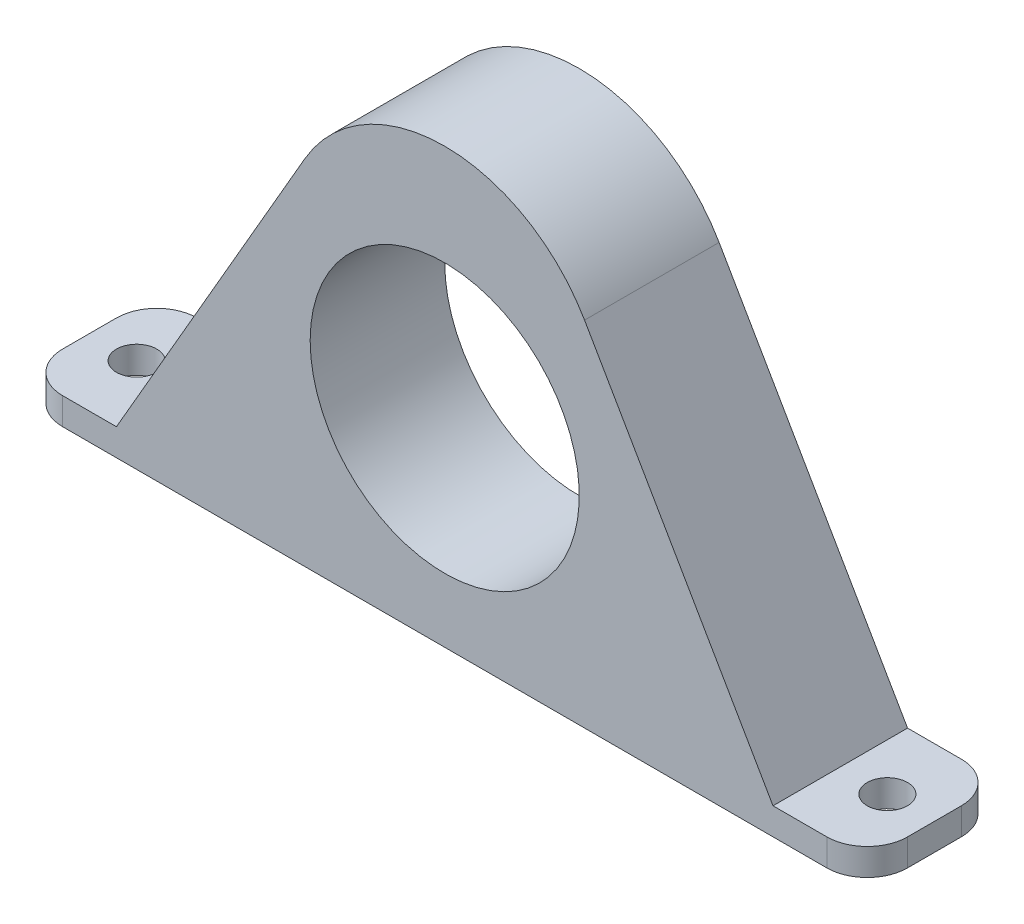
ISO-10303-21;
HEADER;
FILE_DESCRIPTION(('STEP AP214'),'2;1');
FILE_NAME('part.step','',(''),(''),'','','');
FILE_SCHEMA(('AUTOMOTIVE_DESIGN { 1 0 10303 214 1 1 1 1 }'));
ENDSEC;
DATA;
#1=APPLICATION_CONTEXT('core data for automotive mechanical design processes');
#2=APPLICATION_PROTOCOL_DEFINITION('international standard','automotive_design',2000,#1);
#3=PRODUCT_CONTEXT('',#1,'mechanical');
#4=PRODUCT('Part','Part','',(#3));
#5=PRODUCT_RELATED_PRODUCT_CATEGORY('part','',(#4));
#6=PRODUCT_DEFINITION_FORMATION('','',#4);
#7=PRODUCT_DEFINITION_CONTEXT('part definition',#1,'design');
#8=PRODUCT_DEFINITION('design','',#6,#7);
#9=PRODUCT_DEFINITION_SHAPE('','',#8);
#10=(LENGTH_UNIT() NAMED_UNIT(*) SI_UNIT(.MILLI.,.METRE.));
#11=(NAMED_UNIT(*) PLANE_ANGLE_UNIT() SI_UNIT($,.RADIAN.));
#12=(NAMED_UNIT(*) SI_UNIT($,.STERADIAN.) SOLID_ANGLE_UNIT());
#13=UNCERTAINTY_MEASURE_WITH_UNIT(LENGTH_MEASURE(1.E-05),#10,'distance_accuracy_value','');
#14=(GEOMETRIC_REPRESENTATION_CONTEXT(3) GLOBAL_UNCERTAINTY_ASSIGNED_CONTEXT((#13)) GLOBAL_UNIT_ASSIGNED_CONTEXT((#10,
#11,#12)) REPRESENTATION_CONTEXT('',''));
#15=CARTESIAN_POINT('',(0.,0.,0.));
#16=DIRECTION('',(0.,0.,1.));
#17=DIRECTION('',(1.,0.,0.));
#18=AXIS2_PLACEMENT_3D('',#15,#16,#17);
#19=CARTESIAN_POINT('',(0.,29.4999999999999,10.));
#20=DIRECTION('',(0.866025403784436,-0.500000000000004,0.));
#21=DIRECTION('',(0.500000000000004,0.866025403784436,0.));
#22=AXIS2_PLACEMENT_3D('',#19,#20,#21);
#23=PLANE('',#22);
#24=DIRECTION('',(-0.500000000000004,-0.866025403784436,0.));
#25=VECTOR('',#24,1.);
#26=CARTESIAN_POINT('',(0.,29.4999999999999,10.));
#27=LINE('',#26,#25);
#28=CARTESIAN_POINT('',(-10.3923048454133,11.5,10.));
#29=VERTEX_POINT('',#28);
#30=CARTESIAN_POINT('',(-24.3961061455568,-12.7552953509474,10.));
#31=VERTEX_POINT('',#30);
#32=EDGE_CURVE('E128',#29,#31,#27,.T.);
#33=ORIENTED_EDGE('',*,*,#32,.F.);
#34=DIRECTION('',(0.,0.,-1.));
#35=VECTOR('',#34,1.);
#36=CARTESIAN_POINT('',(-10.3923048454133,11.5,0.));
#37=LINE('',#36,#35);
#38=CARTESIAN_POINT('',(-10.3923048454133,11.5,0.));
#39=VERTEX_POINT('',#38);
#40=EDGE_CURVE('E144',#29,#39,#37,.T.);
#41=ORIENTED_EDGE('',*,*,#40,.T.);
#42=DIRECTION('',(-0.500000000000004,-0.866025403784436,0.));
#43=VECTOR('',#42,1.);
#44=CARTESIAN_POINT('',(0.,29.4999999999999,0.));
#45=LINE('',#44,#43);
#46=CARTESIAN_POINT('',(-24.3961061455568,-12.7552953509474,0.));
#47=VERTEX_POINT('',#46);
#48=EDGE_CURVE('E143',#39,#47,#45,.T.);
#49=ORIENTED_EDGE('',*,*,#48,.T.);
#50=DIRECTION('',(0.,0.,-1.));
#51=VECTOR('',#50,1.);
#52=CARTESIAN_POINT('',(-24.3961061455568,-12.7552953509474,10.));
#53=LINE('',#52,#51);
#54=EDGE_CURVE('E125',#31,#47,#53,.T.);
#55=ORIENTED_EDGE('',*,*,#54,.F.);
#56=EDGE_LOOP('',(#33,#41,#49,#55));
#57=FACE_BOUND('',#56,.T.);
#58=ADVANCED_FACE('F32',(#57),#23,.F.);
#59=CARTESIAN_POINT('',(-31.3961061455568,-12.7552953509474,10.));
#60=DIRECTION('',(0.,1.,0.));
#61=DIRECTION('',(0.,0.,1.));
#62=AXIS2_PLACEMENT_3D('',#59,#60,#61);
#63=PLANE('',#62);
#64=CARTESIAN_POINT('',(-27.8961061455568,-12.7552953509474,5.));
#65=DIRECTION('',(0.,1.,0.));
#66=DIRECTION('',(-1.,0.,0.));
#67=AXIS2_PLACEMENT_3D('',#64,#65,#66);
#68=CIRCLE('',#67,1.5);
#69=CARTESIAN_POINT('',(-29.3961061455568,-12.7552953509474,5.));
#70=VERTEX_POINT('',#69);
#71=EDGE_CURVE('E411',#70,#70,#68,.T.);
#72=ORIENTED_EDGE('',*,*,#71,.F.);
#73=EDGE_LOOP('',(#72));
#74=FACE_BOUND('',#73,.T.);
#75=DIRECTION('',(1.,0.,0.));
#76=VECTOR('',#75,1.);
#77=CARTESIAN_POINT('',(-31.3961061455568,-12.7552953509474,0.));
#78=LINE('',#77,#76);
#79=CARTESIAN_POINT('',(-28.3961061455568,-12.7552953509474,0.));
#80=VERTEX_POINT('',#79);
#81=EDGE_CURVE('E208',#80,#47,#78,.T.);
#82=ORIENTED_EDGE('',*,*,#81,.F.);
#83=CARTESIAN_POINT('',(-28.3961061455568,-12.7552953509474,3.));
#84=DIRECTION('',(0.,1.,0.));
#85=DIRECTION('',(0.,0.,1.));
#86=AXIS2_PLACEMENT_3D('',#83,#84,#85);
#87=CIRCLE('',#86,3.);
#88=CARTESIAN_POINT('',(-31.3961061455568,-12.7552953509474,3.));
#89=VERTEX_POINT('',#88);
#90=EDGE_CURVE('E47',#80,#89,#87,.T.);
#91=ORIENTED_EDGE('',*,*,#90,.T.);
#92=DIRECTION('',(0.,0.,-1.));
#93=VECTOR('',#92,1.);
#94=CARTESIAN_POINT('',(-31.3961061455568,-12.7552953509474,10.));
#95=LINE('',#94,#93);
#96=CARTESIAN_POINT('',(-31.3961061455568,-12.7552953509474,7.));
#97=VERTEX_POINT('',#96);
#98=EDGE_CURVE('E145',#97,#89,#95,.T.);
#99=ORIENTED_EDGE('',*,*,#98,.F.);
#100=CARTESIAN_POINT('',(-28.3961061455568,-12.7552953509474,7.));
#101=DIRECTION('',(0.,1.,0.));
#102=DIRECTION('',(0.,0.,1.));
#103=AXIS2_PLACEMENT_3D('',#100,#101,#102);
#104=CIRCLE('',#103,3.);
#105=CARTESIAN_POINT('',(-28.3961061455568,-12.7552953509474,10.));
#106=VERTEX_POINT('',#105);
#107=EDGE_CURVE('E55',#97,#106,#104,.T.);
#108=ORIENTED_EDGE('',*,*,#107,.T.);
#109=DIRECTION('',(1.,0.,0.));
#110=VECTOR('',#109,1.);
#111=CARTESIAN_POINT('',(-31.3961061455568,-12.7552953509474,10.));
#112=LINE('',#111,#110);
#113=EDGE_CURVE('E121',#106,#31,#112,.T.);
#114=ORIENTED_EDGE('',*,*,#113,.T.);
#115=ORIENTED_EDGE('',*,*,#54,.T.);
#116=EDGE_LOOP('',(#82,#91,#99,#108,#114,#115));
#117=FACE_BOUND('',#116,.T.);
#118=ADVANCED_FACE('F123',(#74,#117),#63,.T.);
#119=CARTESIAN_POINT('',(-31.3961061455568,-14.7552953509474,10.));
#120=DIRECTION('',(-1.,0.,0.));
#121=DIRECTION('',(0.,0.,1.));
#122=AXIS2_PLACEMENT_3D('',#119,#120,#121);
#123=PLANE('',#122);
#124=ORIENTED_EDGE('',*,*,#98,.T.);
#125=DIRECTION('',(0.,1.,0.));
#126=VECTOR('',#125,1.);
#127=CARTESIAN_POINT('',(-31.3961061455568,-14.7552953509474,3.));
#128=LINE('',#127,#126);
#129=CARTESIAN_POINT('',(-31.3961061455568,-14.7552953509474,3.));
#130=VERTEX_POINT('',#129);
#131=EDGE_CURVE('E11',#89,#130,#128,.F.);
#132=ORIENTED_EDGE('',*,*,#131,.T.);
#133=DIRECTION('',(0.,0.,-1.));
#134=VECTOR('',#133,1.);
#135=CARTESIAN_POINT('',(-31.3961061455568,-14.7552953509474,10.));
#136=LINE('',#135,#134);
#137=CARTESIAN_POINT('',(-31.3961061455568,-14.7552953509474,7.));
#138=VERTEX_POINT('',#137);
#139=EDGE_CURVE('E149',#138,#130,#136,.T.);
#140=ORIENTED_EDGE('',*,*,#139,.F.);
#141=DIRECTION('',(0.,1.,0.));
#142=VECTOR('',#141,1.);
#143=CARTESIAN_POINT('',(-31.3961061455568,-14.7552953509474,7.));
#144=LINE('',#143,#142);
#145=EDGE_CURVE('E40',#138,#97,#144,.T.);
#146=ORIENTED_EDGE('',*,*,#145,.T.);
#147=EDGE_LOOP('',(#124,#132,#140,#146));
#148=FACE_BOUND('',#147,.T.);
#149=ADVANCED_FACE('F187',(#148),#123,.T.);
#150=CARTESIAN_POINT('',(25.5569212285262,-14.7552953509474,10.));
#151=DIRECTION('',(0.,1.,0.));
#152=DIRECTION('',(-1.,0.,0.));
#153=AXIS2_PLACEMENT_3D('',#150,#151,#152);
#154=PLANE('',#153);
#155=CARTESIAN_POINT('',(-27.8961061455568,-14.7552953509474,5.));
#156=DIRECTION('',(0.,1.,0.));
#157=DIRECTION('',(-1.,0.,0.));
#158=AXIS2_PLACEMENT_3D('',#155,#156,#157);
#159=CIRCLE('',#158,1.5);
#160=CARTESIAN_POINT('',(-29.3961061455568,-14.7552953509474,5.));
#161=VERTEX_POINT('',#160);
#162=EDGE_CURVE('E408',#161,#161,#159,.T.);
#163=ORIENTED_EDGE('',*,*,#162,.T.);
#164=EDGE_LOOP('',(#163));
#165=FACE_BOUND('',#164,.T.);
#166=CARTESIAN_POINT('',(27.8961061455564,-14.7552953509474,5.));
#167=DIRECTION('',(0.,1.,0.));
#168=DIRECTION('',(-1.,0.,0.));
#169=AXIS2_PLACEMENT_3D('',#166,#167,#168);
#170=CIRCLE('',#169,1.5);
#171=CARTESIAN_POINT('',(26.3961061455564,-14.7552953509474,5.));
#172=VERTEX_POINT('',#171);
#173=EDGE_CURVE('E416',#172,#172,#170,.T.);
#174=ORIENTED_EDGE('',*,*,#173,.T.);
#175=EDGE_LOOP('',(#174));
#176=FACE_BOUND('',#175,.T.);
#177=DIRECTION('',(1.,0.,0.));
#178=VECTOR('',#177,1.);
#179=CARTESIAN_POINT('',(25.5569212285262,-14.7552953509474,0.));
#180=LINE('',#179,#178);
#181=CARTESIAN_POINT('',(-28.3961061455568,-14.7552953509474,0.));
#182=VERTEX_POINT('',#181);
#183=CARTESIAN_POINT('',(28.3961061455564,-14.7552953509473,0.));
#184=VERTEX_POINT('',#183);
#185=EDGE_CURVE('E211',#182,#184,#180,.T.);
#186=ORIENTED_EDGE('',*,*,#185,.T.);
#187=CARTESIAN_POINT('',(28.3961061455564,-14.7552953509473,3.));
#188=DIRECTION('',(0.,1.,0.));
#189=DIRECTION('',(-1.,0.,0.));
#190=AXIS2_PLACEMENT_3D('',#187,#188,#189);
#191=CIRCLE('',#190,3.);
#192=CARTESIAN_POINT('',(31.3961061455564,-14.7552953509473,3.));
#193=VERTEX_POINT('',#192);
#194=EDGE_CURVE('E177',#184,#193,#191,.F.);
#195=ORIENTED_EDGE('',*,*,#194,.T.);
#196=DIRECTION('',(0.,0.,-1.));
#197=VECTOR('',#196,1.);
#198=CARTESIAN_POINT('',(31.3961061455564,-14.7552953509473,10.));
#199=LINE('',#198,#197);
#200=CARTESIAN_POINT('',(31.3961061455564,-14.7552953509473,7.));
#201=VERTEX_POINT('',#200);
#202=EDGE_CURVE('E222',#201,#193,#199,.T.);
#203=ORIENTED_EDGE('',*,*,#202,.F.);
#204=CARTESIAN_POINT('',(28.3961061455564,-14.7552953509473,7.));
#205=DIRECTION('',(0.,1.,0.));
#206=DIRECTION('',(-1.,0.,0.));
#207=AXIS2_PLACEMENT_3D('',#204,#205,#206);
#208=CIRCLE('',#207,3.);
#209=CARTESIAN_POINT('',(28.3961061455564,-14.7552953509474,10.));
#210=VERTEX_POINT('',#209);
#211=EDGE_CURVE('E175',#201,#210,#208,.F.);
#212=ORIENTED_EDGE('',*,*,#211,.T.);
#213=DIRECTION('',(-1.,0.,0.));
#214=VECTOR('',#213,1.);
#215=CARTESIAN_POINT('',(-25.5569212285254,-14.7552953509474,10.));
#216=LINE('',#215,#214);
#217=CARTESIAN_POINT('',(-28.3961061455568,-14.7552953509474,10.));
#218=VERTEX_POINT('',#217);
#219=EDGE_CURVE('E127',#210,#218,#216,.T.);
#220=ORIENTED_EDGE('',*,*,#219,.T.);
#221=CARTESIAN_POINT('',(-28.3961061455568,-14.7552953509474,7.));
#222=DIRECTION('',(0.,1.,0.));
#223=DIRECTION('',(-1.,0.,0.));
#224=AXIS2_PLACEMENT_3D('',#221,#222,#223);
#225=CIRCLE('',#224,3.);
#226=EDGE_CURVE('E171',#218,#138,#225,.F.);
#227=ORIENTED_EDGE('',*,*,#226,.T.);
#228=ORIENTED_EDGE('',*,*,#139,.T.);
#229=CARTESIAN_POINT('',(-28.3961061455568,-14.7552953509474,3.));
#230=DIRECTION('',(0.,1.,0.));
#231=DIRECTION('',(-1.,0.,0.));
#232=AXIS2_PLACEMENT_3D('',#229,#230,#231);
#233=CIRCLE('',#232,3.);
#234=EDGE_CURVE('E173',#130,#182,#233,.F.);
#235=ORIENTED_EDGE('',*,*,#234,.T.);
#236=EDGE_LOOP('',(#186,#195,#203,#212,#220,#227,#228,#235));
#237=FACE_BOUND('',#236,.T.);
#238=ADVANCED_FACE('F194',(#165,#176,#237),#154,.F.);
#239=CARTESIAN_POINT('',(31.3961061455564,-14.7552953509473,10.));
#240=DIRECTION('',(-1.,0.,0.));
#241=DIRECTION('',(0.,0.,1.));
#242=AXIS2_PLACEMENT_3D('',#239,#240,#241);
#243=PLANE('',#242);
#244=ORIENTED_EDGE('',*,*,#202,.T.);
#245=DIRECTION('',(0.,1.,0.));
#246=VECTOR('',#245,1.);
#247=CARTESIAN_POINT('',(31.3961061455564,-14.7552953509473,3.));
#248=LINE('',#247,#246);
#249=CARTESIAN_POINT('',(31.3961061455564,-12.7552953509473,3.));
#250=VERTEX_POINT('',#249);
#251=EDGE_CURVE('E159',#193,#250,#248,.T.);
#252=ORIENTED_EDGE('',*,*,#251,.T.);
#253=DIRECTION('',(0.,0.,-1.));
#254=VECTOR('',#253,1.);
#255=CARTESIAN_POINT('',(31.3961061455564,-12.7552953509473,10.));
#256=LINE('',#255,#254);
#257=CARTESIAN_POINT('',(31.3961061455564,-12.7552953509473,7.));
#258=VERTEX_POINT('',#257);
#259=EDGE_CURVE('E219',#258,#250,#256,.T.);
#260=ORIENTED_EDGE('',*,*,#259,.F.);
#261=DIRECTION('',(0.,1.,0.));
#262=VECTOR('',#261,1.);
#263=CARTESIAN_POINT('',(31.3961061455564,-14.7552953509473,7.));
#264=LINE('',#263,#262);
#265=EDGE_CURVE('E157',#258,#201,#264,.F.);
#266=ORIENTED_EDGE('',*,*,#265,.T.);
#267=EDGE_LOOP('',(#244,#252,#260,#266));
#268=FACE_BOUND('',#267,.T.);
#269=ADVANCED_FACE('F226',(#268),#243,.F.);
#270=CARTESIAN_POINT('',(31.3961061455564,-12.7552953509473,10.));
#271=DIRECTION('',(0.,-1.,0.));
#272=DIRECTION('',(1.,0.,0.));
#273=AXIS2_PLACEMENT_3D('',#270,#271,#272);
#274=PLANE('',#273);
#275=CARTESIAN_POINT('',(27.8961061455564,-12.7552953509474,5.));
#276=DIRECTION('',(0.,1.,0.));
#277=DIRECTION('',(-1.,0.,0.));
#278=AXIS2_PLACEMENT_3D('',#275,#276,#277);
#279=CIRCLE('',#278,1.5);
#280=CARTESIAN_POINT('',(26.3961061455564,-12.7552953509474,5.));
#281=VERTEX_POINT('',#280);
#282=EDGE_CURVE('E413',#281,#281,#279,.T.);
#283=ORIENTED_EDGE('',*,*,#282,.F.);
#284=EDGE_LOOP('',(#283));
#285=FACE_BOUND('',#284,.T.);
#286=ORIENTED_EDGE('',*,*,#259,.T.);
#287=CARTESIAN_POINT('',(28.3961061455564,-12.7552953509474,3.));
#288=DIRECTION('',(0.,-1.,0.));
#289=DIRECTION('',(1.,0.,0.));
#290=AXIS2_PLACEMENT_3D('',#287,#288,#289);
#291=CIRCLE('',#290,3.);
#292=CARTESIAN_POINT('',(28.3961061455564,-12.7552953509474,0.));
#293=VERTEX_POINT('',#292);
#294=EDGE_CURVE('E164',#250,#293,#291,.F.);
#295=ORIENTED_EDGE('',*,*,#294,.T.);
#296=DIRECTION('',(-1.,0.,0.));
#297=VECTOR('',#296,1.);
#298=CARTESIAN_POINT('',(31.3961061455564,-12.7552953509473,0.));
#299=LINE('',#298,#297);
#300=CARTESIAN_POINT('',(24.3961061455564,-12.7552953509474,0.));
#301=VERTEX_POINT('',#300);
#302=EDGE_CURVE('E213',#293,#301,#299,.T.);
#303=ORIENTED_EDGE('',*,*,#302,.T.);
#304=DIRECTION('',(0.,0.,-1.));
#305=VECTOR('',#304,1.);
#306=CARTESIAN_POINT('',(24.3961061455564,-12.7552953509474,10.));
#307=LINE('',#306,#305);
#308=CARTESIAN_POINT('',(24.3961061455564,-12.7552953509474,10.));
#309=VERTEX_POINT('',#308);
#310=EDGE_CURVE('E206',#309,#301,#307,.T.);
#311=ORIENTED_EDGE('',*,*,#310,.F.);
#312=DIRECTION('',(-1.,0.,0.));
#313=VECTOR('',#312,1.);
#314=CARTESIAN_POINT('',(31.3961061455564,-12.7552953509473,10.));
#315=LINE('',#314,#313);
#316=CARTESIAN_POINT('',(28.3961061455564,-12.7552953509474,10.));
#317=VERTEX_POINT('',#316);
#318=EDGE_CURVE('E199',#317,#309,#315,.T.);
#319=ORIENTED_EDGE('',*,*,#318,.F.);
#320=CARTESIAN_POINT('',(28.3961061455564,-12.7552953509474,7.));
#321=DIRECTION('',(0.,-1.,0.));
#322=DIRECTION('',(1.,0.,0.));
#323=AXIS2_PLACEMENT_3D('',#320,#321,#322);
#324=CIRCLE('',#323,3.);
#325=EDGE_CURVE('E162',#317,#258,#324,.F.);
#326=ORIENTED_EDGE('',*,*,#325,.T.);
#327=EDGE_LOOP('',(#286,#295,#303,#311,#319,#326));
#328=FACE_BOUND('',#327,.T.);
#329=ADVANCED_FACE('F235',(#285,#328),#274,.F.);
#330=CARTESIAN_POINT('',(0.,29.4999999999999,10.));
#331=DIRECTION('',(0.86602540378444,0.499999999999998,0.));
#332=DIRECTION('',(-0.499999999999998,0.86602540378444,0.));
#333=AXIS2_PLACEMENT_3D('',#330,#331,#332);
#334=PLANE('',#333);
#335=DIRECTION('',(0.499999999999998,-0.86602540378444,0.));
#336=VECTOR('',#335,1.);
#337=CARTESIAN_POINT('',(0.,29.4999999999999,0.));
#338=LINE('',#337,#336);
#339=CARTESIAN_POINT('',(10.3923048454132,11.4999999999999,0.));
#340=VERTEX_POINT('',#339);
#341=EDGE_CURVE('E139',#340,#301,#338,.T.);
#342=ORIENTED_EDGE('',*,*,#341,.F.);
#343=DIRECTION('',(0.,0.,-1.));
#344=VECTOR('',#343,1.);
#345=CARTESIAN_POINT('',(10.3923048454132,11.4999999999999,10.));
#346=LINE('',#345,#344);
#347=CARTESIAN_POINT('',(10.3923048454132,11.4999999999999,10.));
#348=VERTEX_POINT('',#347);
#349=EDGE_CURVE('E154',#340,#348,#346,.F.);
#350=ORIENTED_EDGE('',*,*,#349,.T.);
#351=DIRECTION('',(0.499999999999998,-0.86602540378444,0.));
#352=VECTOR('',#351,1.);
#353=CARTESIAN_POINT('',(0.,29.4999999999999,10.));
#354=LINE('',#353,#352);
#355=EDGE_CURVE('E201',#348,#309,#354,.T.);
#356=ORIENTED_EDGE('',*,*,#355,.T.);
#357=ORIENTED_EDGE('',*,*,#310,.T.);
#358=EDGE_LOOP('',(#342,#350,#356,#357));
#359=FACE_BOUND('',#358,.T.);
#360=ADVANCED_FACE('F243',(#359),#334,.T.);
#361=CARTESIAN_POINT('',(0.,0.,10.));
#362=DIRECTION('',(0.,0.,1.));
#363=DIRECTION('',(1.,0.,0.));
#364=AXIS2_PLACEMENT_3D('',#361,#362,#363);
#365=PLANE('',#364);
#366=CARTESIAN_POINT('',(0.,0.,10.));
#367=DIRECTION('',(0.,0.,-1.));
#368=DIRECTION('',(-1.,0.,0.));
#369=AXIS2_PLACEMENT_3D('',#366,#367,#368);
#370=CIRCLE('',#369,10.);
#371=CARTESIAN_POINT('',(-10.,0.,10.));
#372=VERTEX_POINT('',#371);
#373=EDGE_CURVE('E209',#372,#372,#370,.T.);
#374=ORIENTED_EDGE('',*,*,#373,.T.);
#375=EDGE_LOOP('',(#374));
#376=FACE_BOUND('',#375,.T.);
#377=ORIENTED_EDGE('',*,*,#219,.F.);
#378=DIRECTION('',(0.,1.,0.));
#379=VECTOR('',#378,1.);
#380=CARTESIAN_POINT('',(28.3961061455564,-12.7552953509473,10.));
#381=LINE('',#380,#379);
#382=EDGE_CURVE('E181',#210,#317,#381,.T.);
#383=ORIENTED_EDGE('',*,*,#382,.T.);
#384=ORIENTED_EDGE('',*,*,#318,.T.);
#385=ORIENTED_EDGE('',*,*,#355,.F.);
#386=CARTESIAN_POINT('',(0.,5.49999999999996,10.));
#387=DIRECTION('',(0.,0.,1.));
#388=DIRECTION('',(1.,0.,0.));
#389=AXIS2_PLACEMENT_3D('',#386,#387,#388);
#390=CIRCLE('',#389,12.);
#391=EDGE_CURVE('E135',#348,#29,#390,.T.);
#392=ORIENTED_EDGE('',*,*,#391,.T.);
#393=ORIENTED_EDGE('',*,*,#32,.T.);
#394=ORIENTED_EDGE('',*,*,#113,.F.);
#395=DIRECTION('',(0.,1.,0.));
#396=VECTOR('',#395,1.);
#397=CARTESIAN_POINT('',(-28.3961061455568,0.,10.));
#398=LINE('',#397,#396);
#399=EDGE_CURVE('E179',#106,#218,#398,.F.);
#400=ORIENTED_EDGE('',*,*,#399,.T.);
#401=EDGE_LOOP('',(#377,#383,#384,#385,#392,#393,#394,#400));
#402=FACE_BOUND('',#401,.T.);
#403=ADVANCED_FACE('F132',(#376,#402),#365,.T.);
#404=CARTESIAN_POINT('',(0.,0.,0.));
#405=DIRECTION('',(0.,0.,1.));
#406=DIRECTION('',(1.,0.,0.));
#407=AXIS2_PLACEMENT_3D('',#404,#405,#406);
#408=PLANE('',#407);
#409=CARTESIAN_POINT('',(0.,0.,0.));
#410=DIRECTION('',(0.,0.,-1.));
#411=DIRECTION('',(-1.,0.,0.));
#412=AXIS2_PLACEMENT_3D('',#409,#410,#411);
#413=CIRCLE('',#412,10.);
#414=CARTESIAN_POINT('',(-10.,0.,0.));
#415=VERTEX_POINT('',#414);
#416=EDGE_CURVE('E419',#415,#415,#413,.T.);
#417=ORIENTED_EDGE('',*,*,#416,.F.);
#418=EDGE_LOOP('',(#417));
#419=FACE_BOUND('',#418,.T.);
#420=ORIENTED_EDGE('',*,*,#302,.F.);
#421=DIRECTION('',(0.,1.,0.));
#422=VECTOR('',#421,1.);
#423=CARTESIAN_POINT('',(28.3961061455564,0.,0.));
#424=LINE('',#423,#422);
#425=EDGE_CURVE('E169',#293,#184,#424,.F.);
#426=ORIENTED_EDGE('',*,*,#425,.T.);
#427=ORIENTED_EDGE('',*,*,#185,.F.);
#428=DIRECTION('',(0.,1.,0.));
#429=VECTOR('',#428,1.);
#430=CARTESIAN_POINT('',(-28.3961061455568,-12.7552953509474,0.));
#431=LINE('',#430,#429);
#432=EDGE_CURVE('E166',#182,#80,#431,.T.);
#433=ORIENTED_EDGE('',*,*,#432,.T.);
#434=ORIENTED_EDGE('',*,*,#81,.T.);
#435=ORIENTED_EDGE('',*,*,#48,.F.);
#436=CARTESIAN_POINT('',(0.,5.49999999999996,0.));
#437=DIRECTION('',(0.,0.,1.));
#438=DIRECTION('',(1.,0.,0.));
#439=AXIS2_PLACEMENT_3D('',#436,#437,#438);
#440=CIRCLE('',#439,12.);
#441=EDGE_CURVE('E147',#39,#340,#440,.F.);
#442=ORIENTED_EDGE('',*,*,#441,.T.);
#443=ORIENTED_EDGE('',*,*,#341,.T.);
#444=EDGE_LOOP('',(#420,#426,#427,#433,#434,#435,#442,#443));
#445=FACE_BOUND('',#444,.T.);
#446=ADVANCED_FACE('F238',(#419,#445),#408,.F.);
#447=CARTESIAN_POINT('',(0.,0.,10.));
#448=DIRECTION('',(0.,0.,-1.));
#449=DIRECTION('',(-1.,0.,0.));
#450=AXIS2_PLACEMENT_3D('',#447,#448,#449);
#451=CYLINDRICAL_SURFACE('',#450,10.);
#452=ORIENTED_EDGE('',*,*,#373,.F.);
#453=EDGE_LOOP('',(#452));
#454=FACE_BOUND('',#453,.T.);
#455=ORIENTED_EDGE('',*,*,#416,.T.);
#456=EDGE_LOOP('',(#455));
#457=FACE_BOUND('',#456,.T.);
#458=ADVANCED_FACE('F269',(#454,#457),#451,.F.);
#459=CARTESIAN_POINT('',(0.,5.49999999999996,10.));
#460=DIRECTION('',(0.,0.,1.));
#461=DIRECTION('',(1.,0.,0.));
#462=AXIS2_PLACEMENT_3D('',#459,#460,#461);
#463=CYLINDRICAL_SURFACE('',#462,12.);
#464=ORIENTED_EDGE('',*,*,#391,.F.);
#465=ORIENTED_EDGE('',*,*,#349,.F.);
#466=ORIENTED_EDGE('',*,*,#441,.F.);
#467=ORIENTED_EDGE('',*,*,#40,.F.);
#468=EDGE_LOOP('',(#464,#465,#466,#467));
#469=FACE_BOUND('',#468,.T.);
#470=ADVANCED_FACE('F266',(#469),#463,.T.);
#471=CARTESIAN_POINT('',(27.8961061455564,-14.7552953509474,5.));
#472=DIRECTION('',(0.,1.,0.));
#473=DIRECTION('',(-1.,0.,0.));
#474=AXIS2_PLACEMENT_3D('',#471,#472,#473);
#475=CYLINDRICAL_SURFACE('',#474,1.5);
#476=ORIENTED_EDGE('',*,*,#173,.F.);
#477=EDGE_LOOP('',(#476));
#478=FACE_BOUND('',#477,.T.);
#479=ORIENTED_EDGE('',*,*,#282,.T.);
#480=EDGE_LOOP('',(#479));
#481=FACE_BOUND('',#480,.T.);
#482=ADVANCED_FACE('F268',(#478,#481),#475,.F.);
#483=CARTESIAN_POINT('',(-27.8961061455568,-14.7552953509474,5.));
#484=DIRECTION('',(0.,1.,0.));
#485=DIRECTION('',(-1.,0.,0.));
#486=AXIS2_PLACEMENT_3D('',#483,#484,#485);
#487=CYLINDRICAL_SURFACE('',#486,1.5);
#488=ORIENTED_EDGE('',*,*,#162,.F.);
#489=EDGE_LOOP('',(#488));
#490=FACE_BOUND('',#489,.T.);
#491=ORIENTED_EDGE('',*,*,#71,.T.);
#492=EDGE_LOOP('',(#491));
#493=FACE_BOUND('',#492,.T.);
#494=ADVANCED_FACE('F255',(#490,#493),#487,.F.);
#495=CARTESIAN_POINT('',(28.3961061455564,-14.7552953509473,3.));
#496=DIRECTION('',(0.,1.,0.));
#497=DIRECTION('',(0.,0.,1.));
#498=AXIS2_PLACEMENT_3D('',#495,#496,#497);
#499=CYLINDRICAL_SURFACE('',#498,3.);
#500=ORIENTED_EDGE('',*,*,#194,.F.);
#501=ORIENTED_EDGE('',*,*,#425,.F.);
#502=ORIENTED_EDGE('',*,*,#294,.F.);
#503=ORIENTED_EDGE('',*,*,#251,.F.);
#504=EDGE_LOOP('',(#500,#501,#502,#503));
#505=FACE_BOUND('',#504,.T.);
#506=ADVANCED_FACE('F231',(#505),#499,.T.);
#507=CARTESIAN_POINT('',(28.3961061455564,0.,7.));
#508=DIRECTION('',(0.,-1.,0.));
#509=DIRECTION('',(0.,0.,-1.));
#510=AXIS2_PLACEMENT_3D('',#507,#508,#509);
#511=CYLINDRICAL_SURFACE('',#510,3.);
#512=ORIENTED_EDGE('',*,*,#211,.F.);
#513=ORIENTED_EDGE('',*,*,#265,.F.);
#514=ORIENTED_EDGE('',*,*,#325,.F.);
#515=ORIENTED_EDGE('',*,*,#382,.F.);
#516=EDGE_LOOP('',(#512,#513,#514,#515));
#517=FACE_BOUND('',#516,.T.);
#518=ADVANCED_FACE('F246',(#517),#511,.T.);
#519=CARTESIAN_POINT('',(-28.3961061455568,0.,3.));
#520=DIRECTION('',(0.,-1.,0.));
#521=DIRECTION('',(0.,0.,-1.));
#522=AXIS2_PLACEMENT_3D('',#519,#520,#521);
#523=CYLINDRICAL_SURFACE('',#522,3.);
#524=ORIENTED_EDGE('',*,*,#234,.F.);
#525=ORIENTED_EDGE('',*,*,#131,.F.);
#526=ORIENTED_EDGE('',*,*,#90,.F.);
#527=ORIENTED_EDGE('',*,*,#432,.F.);
#528=EDGE_LOOP('',(#524,#525,#526,#527));
#529=FACE_BOUND('',#528,.T.);
#530=ADVANCED_FACE('F248',(#529),#523,.T.);
#531=CARTESIAN_POINT('',(-28.3961061455568,-14.7552953509474,7.));
#532=DIRECTION('',(0.,1.,0.));
#533=DIRECTION('',(0.,0.,1.));
#534=AXIS2_PLACEMENT_3D('',#531,#532,#533);
#535=CYLINDRICAL_SURFACE('',#534,3.);
#536=ORIENTED_EDGE('',*,*,#226,.F.);
#537=ORIENTED_EDGE('',*,*,#399,.F.);
#538=ORIENTED_EDGE('',*,*,#107,.F.);
#539=ORIENTED_EDGE('',*,*,#145,.F.);
#540=EDGE_LOOP('',(#536,#537,#538,#539));
#541=FACE_BOUND('',#540,.T.);
#542=ADVANCED_FACE('F34',(#541),#535,.T.);
#543=CLOSED_SHELL('',(#58,#118,#149,#238,#269,#329,#360,#403,#446,#458,#470,#482,#494,#506,#518,
#530,#542));
#544=MANIFOLD_SOLID_BREP('B2',#543);
#545=ADVANCED_BREP_SHAPE_REPRESENTATION('',(#18,#544),#14);
#546=SHAPE_DEFINITION_REPRESENTATION(#9,#545);
ENDSEC;
END-ISO-10303-21;
